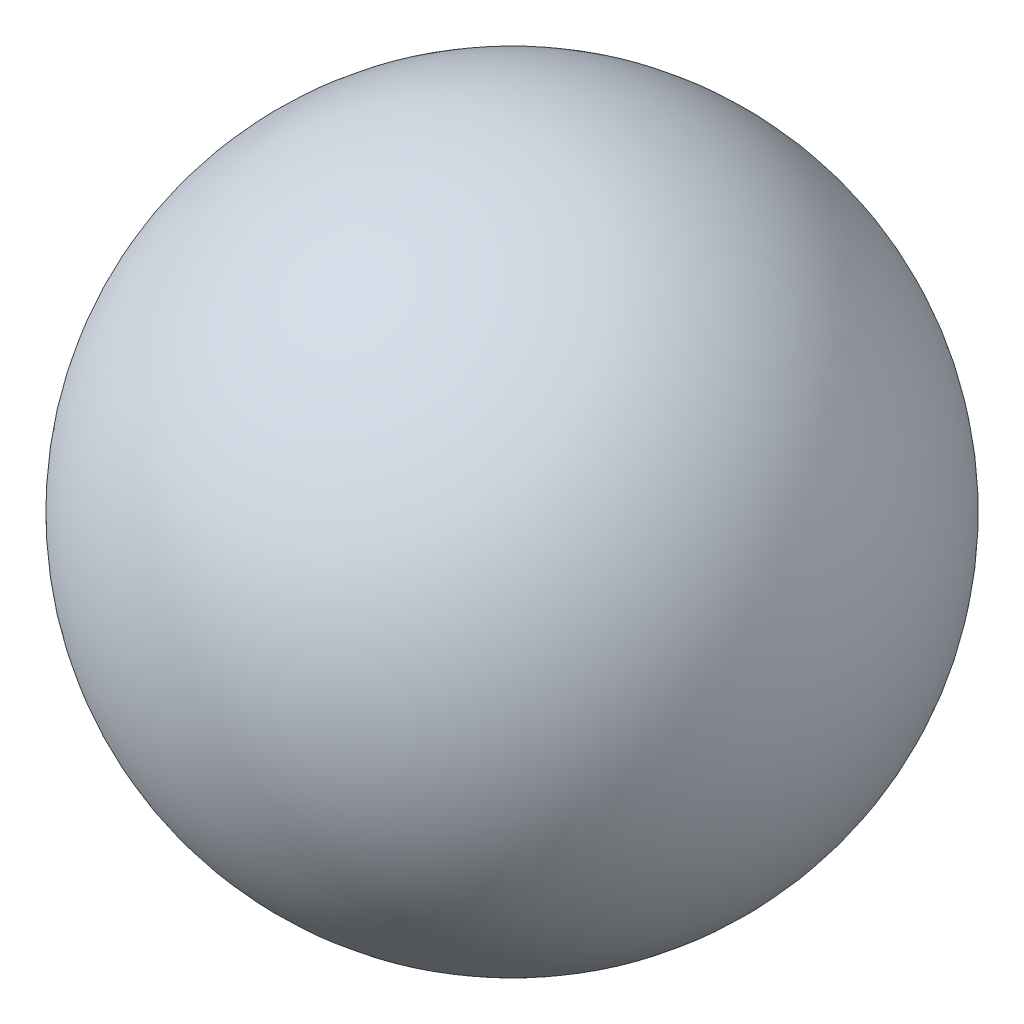
ISO-10303-21;
HEADER;
FILE_DESCRIPTION(('STEP AP214'),'2;1');
FILE_NAME('part.step','',(''),(''),'','','');
FILE_SCHEMA(('AUTOMOTIVE_DESIGN { 1 0 10303 214 1 1 1 1 }'));
ENDSEC;
DATA;
#1=APPLICATION_CONTEXT('core data for automotive mechanical design processes');
#2=APPLICATION_PROTOCOL_DEFINITION('international standard','automotive_design',2000,#1);
#3=PRODUCT_CONTEXT('',#1,'mechanical');
#4=PRODUCT('Part','Part','',(#3));
#5=PRODUCT_RELATED_PRODUCT_CATEGORY('part','',(#4));
#6=PRODUCT_DEFINITION_FORMATION('','',#4);
#7=PRODUCT_DEFINITION_CONTEXT('part definition',#1,'design');
#8=PRODUCT_DEFINITION('design','',#6,#7);
#9=PRODUCT_DEFINITION_SHAPE('','',#8);
#10=(LENGTH_UNIT() NAMED_UNIT(*) SI_UNIT(.MILLI.,.METRE.));
#11=(NAMED_UNIT(*) PLANE_ANGLE_UNIT() SI_UNIT($,.RADIAN.));
#12=(NAMED_UNIT(*) SI_UNIT($,.STERADIAN.) SOLID_ANGLE_UNIT());
#13=UNCERTAINTY_MEASURE_WITH_UNIT(LENGTH_MEASURE(1.E-05),#10,'distance_accuracy_value','');
#14=(GEOMETRIC_REPRESENTATION_CONTEXT(3) GLOBAL_UNCERTAINTY_ASSIGNED_CONTEXT((#13)) GLOBAL_UNIT_ASSIGNED_CONTEXT((#10,
#11,#12)) REPRESENTATION_CONTEXT('',''));
#15=CARTESIAN_POINT('',(0.,0.,0.));
#16=DIRECTION('',(0.,0.,1.));
#17=DIRECTION('',(1.,0.,0.));
#18=AXIS2_PLACEMENT_3D('',#15,#16,#17);
#19=CARTESIAN_POINT('',(0.,0.,0.));
#20=DIRECTION('',(0.,1.,0.));
#21=DIRECTION('',(1.,0.,0.));
#22=AXIS2_PLACEMENT_3D('',#19,#20,#21);
#23=SPHERICAL_SURFACE('',#22,16.);
#24=CARTESIAN_POINT('',(0.,16.,0.));
#25=VERTEX_POINT('',#24);
#26=VERTEX_LOOP('',#25);
#27=FACE_BOUND('',#26,.T.);
#28=ADVANCED_FACE('F40',(#27),#23,.T.);
#29=CLOSED_SHELL('',(#28));
#30=CARTESIAN_POINT('',(0.,0.,0.));
#31=DIRECTION('',(0.,1.,0.));
#32=DIRECTION('',(1.,0.,0.));
#33=AXIS2_PLACEMENT_3D('',#30,#31,#32);
#34=SPHERICAL_SURFACE('',#33,15.);
#35=CARTESIAN_POINT('',(0.,15.,0.));
#36=VERTEX_POINT('',#35);
#37=VERTEX_LOOP('',#36);
#38=FACE_BOUND('',#37,.T.);
#39=ADVANCED_FACE('F53',(#38),#34,.F.);
#40=CLOSED_SHELL('',(#39));
#41=ORIENTED_CLOSED_SHELL('',*,#40,.T.);
#42=BREP_WITH_VOIDS('B2',#29,(#41));
#43=ADVANCED_BREP_SHAPE_REPRESENTATION('',(#18,#42),#14);
#44=SHAPE_DEFINITION_REPRESENTATION(#9,#43);
ENDSEC;
END-ISO-10303-21;
